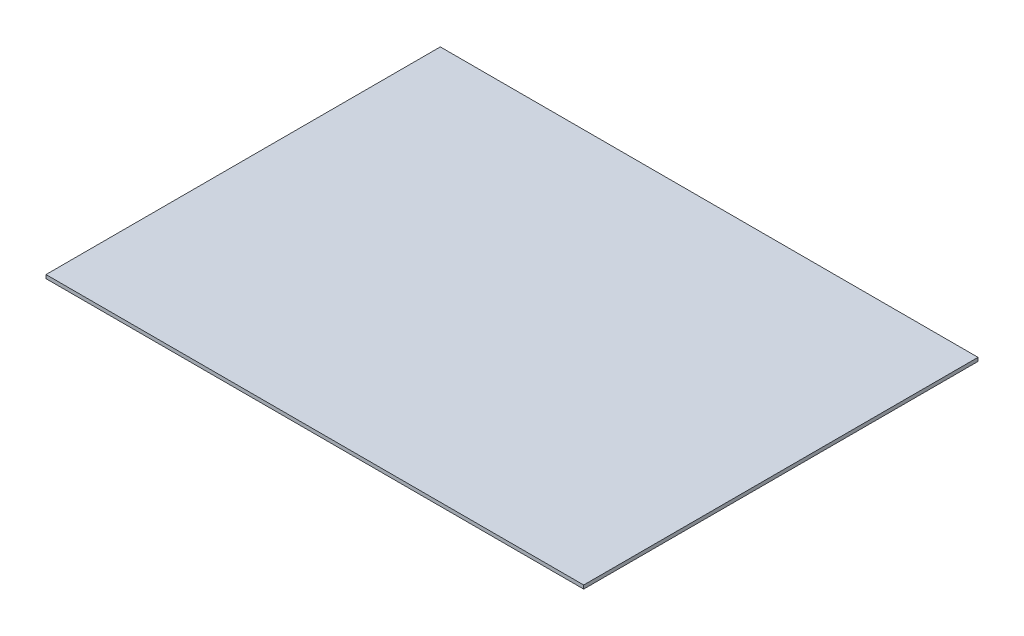
ISO-10303-21;
HEADER;
FILE_DESCRIPTION(('STEP AP214'),'2;1');
FILE_NAME('part.step','',(''),(''),'','','');
FILE_SCHEMA(('AUTOMOTIVE_DESIGN { 1 0 10303 214 1 1 1 1 }'));
ENDSEC;
DATA;
#1=APPLICATION_CONTEXT('core data for automotive mechanical design processes');
#2=APPLICATION_PROTOCOL_DEFINITION('international standard','automotive_design',2000,#1);
#3=PRODUCT_CONTEXT('',#1,'mechanical');
#4=PRODUCT('Part','Part','',(#3));
#5=PRODUCT_RELATED_PRODUCT_CATEGORY('part','',(#4));
#6=PRODUCT_DEFINITION_FORMATION('','',#4);
#7=PRODUCT_DEFINITION_CONTEXT('part definition',#1,'design');
#8=PRODUCT_DEFINITION('design','',#6,#7);
#9=PRODUCT_DEFINITION_SHAPE('','',#8);
#10=(LENGTH_UNIT() NAMED_UNIT(*) SI_UNIT(.MILLI.,.METRE.));
#11=(NAMED_UNIT(*) PLANE_ANGLE_UNIT() SI_UNIT($,.RADIAN.));
#12=(NAMED_UNIT(*) SI_UNIT($,.STERADIAN.) SOLID_ANGLE_UNIT());
#13=UNCERTAINTY_MEASURE_WITH_UNIT(LENGTH_MEASURE(1.E-05),#10,'distance_accuracy_value','');
#14=(GEOMETRIC_REPRESENTATION_CONTEXT(3) GLOBAL_UNCERTAINTY_ASSIGNED_CONTEXT((#13)) GLOBAL_UNIT_ASSIGNED_CONTEXT((#10,
#11,#12)) REPRESENTATION_CONTEXT('',''));
#15=CARTESIAN_POINT('',(0.,0.,0.));
#16=DIRECTION('',(0.,0.,1.));
#17=DIRECTION('',(1.,0.,0.));
#18=AXIS2_PLACEMENT_3D('',#15,#16,#17);
#19=CARTESIAN_POINT('',(150.,2.,110.));
#20=DIRECTION('',(-1.,0.,0.));
#21=DIRECTION('',(0.,0.,1.));
#22=AXIS2_PLACEMENT_3D('',#19,#20,#21);
#23=PLANE('',#22);
#24=DIRECTION('',(0.,0.,-1.));
#25=VECTOR('',#24,1.);
#26=CARTESIAN_POINT('',(150.,0.,110.));
#27=LINE('',#26,#25);
#28=CARTESIAN_POINT('',(150.,0.,110.));
#29=VERTEX_POINT('',#28);
#30=CARTESIAN_POINT('',(150.,0.,-110.));
#31=VERTEX_POINT('',#30);
#32=EDGE_CURVE('E100',#29,#31,#27,.T.);
#33=ORIENTED_EDGE('',*,*,#32,.T.);
#34=DIRECTION('',(0.,-1.,0.));
#35=VECTOR('',#34,1.);
#36=CARTESIAN_POINT('',(150.,2.,-110.));
#37=LINE('',#36,#35);
#38=CARTESIAN_POINT('',(150.,2.,-110.));
#39=VERTEX_POINT('',#38);
#40=EDGE_CURVE('E11',#39,#31,#37,.T.);
#41=ORIENTED_EDGE('',*,*,#40,.F.);
#42=DIRECTION('',(0.,0.,-1.));
#43=VECTOR('',#42,1.);
#44=CARTESIAN_POINT('',(150.,2.,110.));
#45=LINE('',#44,#43);
#46=CARTESIAN_POINT('',(150.,2.,110.));
#47=VERTEX_POINT('',#46);
#48=EDGE_CURVE('E88',#47,#39,#45,.T.);
#49=ORIENTED_EDGE('',*,*,#48,.F.);
#50=DIRECTION('',(0.,-1.,0.));
#51=VECTOR('',#50,1.);
#52=CARTESIAN_POINT('',(150.,2.,110.));
#53=LINE('',#52,#51);
#54=EDGE_CURVE('E96',#47,#29,#53,.T.);
#55=ORIENTED_EDGE('',*,*,#54,.T.);
#56=EDGE_LOOP('',(#33,#41,#49,#55));
#57=FACE_BOUND('',#56,.T.);
#58=ADVANCED_FACE('F37',(#57),#23,.F.);
#59=CARTESIAN_POINT('',(-150.,2.,-110.));
#60=DIRECTION('',(0.,0.,1.));
#61=DIRECTION('',(1.,0.,0.));
#62=AXIS2_PLACEMENT_3D('',#59,#60,#61);
#63=PLANE('',#62);
#64=DIRECTION('',(-1.,0.,0.));
#65=VECTOR('',#64,1.);
#66=CARTESIAN_POINT('',(-150.,0.,-110.));
#67=LINE('',#66,#65);
#68=CARTESIAN_POINT('',(-150.,0.,-110.));
#69=VERTEX_POINT('',#68);
#70=EDGE_CURVE('E92',#31,#69,#67,.T.);
#71=ORIENTED_EDGE('',*,*,#70,.T.);
#72=DIRECTION('',(0.,-1.,0.));
#73=VECTOR('',#72,1.);
#74=CARTESIAN_POINT('',(-150.,2.,-110.));
#75=LINE('',#74,#73);
#76=CARTESIAN_POINT('',(-150.,2.,-110.));
#77=VERTEX_POINT('',#76);
#78=EDGE_CURVE('E45',#77,#69,#75,.T.);
#79=ORIENTED_EDGE('',*,*,#78,.F.);
#80=DIRECTION('',(-1.,0.,0.));
#81=VECTOR('',#80,1.);
#82=CARTESIAN_POINT('',(-150.,2.,-110.));
#83=LINE('',#82,#81);
#84=EDGE_CURVE('E83',#39,#77,#83,.T.);
#85=ORIENTED_EDGE('',*,*,#84,.F.);
#86=ORIENTED_EDGE('',*,*,#40,.T.);
#87=EDGE_LOOP('',(#71,#79,#85,#86));
#88=FACE_BOUND('',#87,.T.);
#89=ADVANCED_FACE('F91',(#88),#63,.F.);
#90=CARTESIAN_POINT('',(-150.,2.,110.));
#91=DIRECTION('',(1.,0.,0.));
#92=DIRECTION('',(0.,0.,-1.));
#93=AXIS2_PLACEMENT_3D('',#90,#91,#92);
#94=PLANE('',#93);
#95=DIRECTION('',(0.,0.,1.));
#96=VECTOR('',#95,1.);
#97=CARTESIAN_POINT('',(-150.,0.,110.));
#98=LINE('',#97,#96);
#99=CARTESIAN_POINT('',(-150.,0.,110.));
#100=VERTEX_POINT('',#99);
#101=EDGE_CURVE('E70',#69,#100,#98,.T.);
#102=ORIENTED_EDGE('',*,*,#101,.T.);
#103=DIRECTION('',(0.,-1.,0.));
#104=VECTOR('',#103,1.);
#105=CARTESIAN_POINT('',(-150.,2.,110.));
#106=LINE('',#105,#104);
#107=CARTESIAN_POINT('',(-150.,2.,110.));
#108=VERTEX_POINT('',#107);
#109=EDGE_CURVE('E93',#108,#100,#106,.T.);
#110=ORIENTED_EDGE('',*,*,#109,.F.);
#111=DIRECTION('',(0.,0.,1.));
#112=VECTOR('',#111,1.);
#113=CARTESIAN_POINT('',(-150.,2.,110.));
#114=LINE('',#113,#112);
#115=EDGE_CURVE('E86',#77,#108,#114,.T.);
#116=ORIENTED_EDGE('',*,*,#115,.F.);
#117=ORIENTED_EDGE('',*,*,#78,.T.);
#118=EDGE_LOOP('',(#102,#110,#116,#117));
#119=FACE_BOUND('',#118,.T.);
#120=ADVANCED_FACE('F94',(#119),#94,.F.);
#121=CARTESIAN_POINT('',(-150.,2.,110.));
#122=DIRECTION('',(0.,0.,-1.));
#123=DIRECTION('',(-1.,0.,0.));
#124=AXIS2_PLACEMENT_3D('',#121,#122,#123);
#125=PLANE('',#124);
#126=DIRECTION('',(1.,0.,0.));
#127=VECTOR('',#126,1.);
#128=CARTESIAN_POINT('',(-150.,0.,110.));
#129=LINE('',#128,#127);
#130=EDGE_CURVE('E76',#100,#29,#129,.T.);
#131=ORIENTED_EDGE('',*,*,#130,.T.);
#132=ORIENTED_EDGE('',*,*,#54,.F.);
#133=DIRECTION('',(1.,0.,0.));
#134=VECTOR('',#133,1.);
#135=CARTESIAN_POINT('',(-150.,2.,110.));
#136=LINE('',#135,#134);
#137=EDGE_CURVE('E53',#108,#47,#136,.T.);
#138=ORIENTED_EDGE('',*,*,#137,.F.);
#139=ORIENTED_EDGE('',*,*,#109,.T.);
#140=EDGE_LOOP('',(#131,#132,#138,#139));
#141=FACE_BOUND('',#140,.T.);
#142=ADVANCED_FACE('F107',(#141),#125,.F.);
#143=CARTESIAN_POINT('',(0.,2.,0.));
#144=DIRECTION('',(0.,-1.,0.));
#145=DIRECTION('',(0.,0.,-1.));
#146=AXIS2_PLACEMENT_3D('',#143,#144,#145);
#147=PLANE('',#146);
#148=ORIENTED_EDGE('',*,*,#48,.T.);
#149=ORIENTED_EDGE('',*,*,#84,.T.);
#150=ORIENTED_EDGE('',*,*,#115,.T.);
#151=ORIENTED_EDGE('',*,*,#137,.T.);
#152=EDGE_LOOP('',(#148,#149,#150,#151));
#153=FACE_BOUND('',#152,.T.);
#154=ADVANCED_FACE('F84',(#153),#147,.F.);
#155=CARTESIAN_POINT('',(0.,0.,0.));
#156=DIRECTION('',(0.,-1.,0.));
#157=DIRECTION('',(0.,0.,-1.));
#158=AXIS2_PLACEMENT_3D('',#155,#156,#157);
#159=PLANE('',#158);
#160=ORIENTED_EDGE('',*,*,#32,.F.);
#161=ORIENTED_EDGE('',*,*,#130,.F.);
#162=ORIENTED_EDGE('',*,*,#101,.F.);
#163=ORIENTED_EDGE('',*,*,#70,.F.);
#164=EDGE_LOOP('',(#160,#161,#162,#163));
#165=FACE_BOUND('',#164,.T.);
#166=ADVANCED_FACE('F110',(#165),#159,.T.);
#167=CLOSED_SHELL('',(#58,#89,#120,#142,#154,#166));
#168=MANIFOLD_SOLID_BREP('B2',#167);
#169=ADVANCED_BREP_SHAPE_REPRESENTATION('',(#18,#168),#14);
#170=SHAPE_DEFINITION_REPRESENTATION(#9,#169);
ENDSEC;
END-ISO-10303-21;
